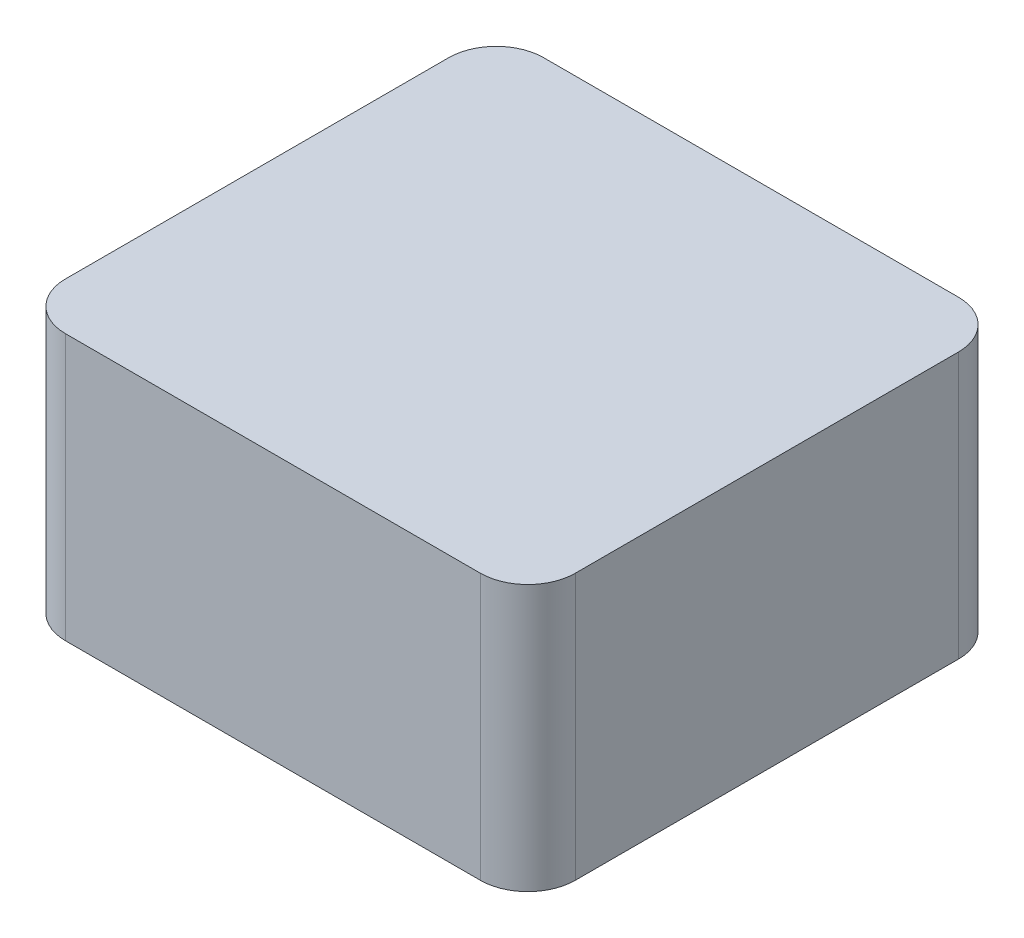
ISO-10303-21;
HEADER;
FILE_DESCRIPTION(('STEP AP214'),'2;1');
FILE_NAME('part.step','',(''),(''),'','','');
FILE_SCHEMA(('AUTOMOTIVE_DESIGN { 1 0 10303 214 1 1 1 1 }'));
ENDSEC;
DATA;
#1=APPLICATION_CONTEXT('core data for automotive mechanical design processes');
#2=APPLICATION_PROTOCOL_DEFINITION('international standard','automotive_design',2000,#1);
#3=PRODUCT_CONTEXT('',#1,'mechanical');
#4=PRODUCT('Part','Part','',(#3));
#5=PRODUCT_RELATED_PRODUCT_CATEGORY('part','',(#4));
#6=PRODUCT_DEFINITION_FORMATION('','',#4);
#7=PRODUCT_DEFINITION_CONTEXT('part definition',#1,'design');
#8=PRODUCT_DEFINITION('design','',#6,#7);
#9=PRODUCT_DEFINITION_SHAPE('','',#8);
#10=(LENGTH_UNIT() NAMED_UNIT(*) SI_UNIT(.MILLI.,.METRE.));
#11=(NAMED_UNIT(*) PLANE_ANGLE_UNIT() SI_UNIT($,.RADIAN.));
#12=(NAMED_UNIT(*) SI_UNIT($,.STERADIAN.) SOLID_ANGLE_UNIT());
#13=UNCERTAINTY_MEASURE_WITH_UNIT(LENGTH_MEASURE(1.E-05),#10,'distance_accuracy_value','');
#14=(GEOMETRIC_REPRESENTATION_CONTEXT(3) GLOBAL_UNCERTAINTY_ASSIGNED_CONTEXT((#13)) GLOBAL_UNIT_ASSIGNED_CONTEXT((#10,
#11,#12)) REPRESENTATION_CONTEXT('',''));
#15=CARTESIAN_POINT('',(0.,0.,0.));
#16=DIRECTION('',(0.,0.,1.));
#17=DIRECTION('',(1.,0.,0.));
#18=AXIS2_PLACEMENT_3D('',#15,#16,#17);
#19=CARTESIAN_POINT('',(0.,21.336,0.));
#20=DIRECTION('',(1.,0.,0.));
#21=DIRECTION('',(0.,0.,-1.));
#22=AXIS2_PLACEMENT_3D('',#19,#20,#21);
#23=PLANE('',#22);
#24=DIRECTION('',(0.,0.,1.));
#25=VECTOR('',#24,1.);
#26=CARTESIAN_POINT('',(0.,21.336,0.));
#27=LINE('',#26,#25);
#28=CARTESIAN_POINT('',(0.,21.336,3.81));
#29=VERTEX_POINT('',#28);
#30=CARTESIAN_POINT('',(0.,21.336,34.544));
#31=VERTEX_POINT('',#30);
#32=EDGE_CURVE('E118',#29,#31,#27,.T.);
#33=ORIENTED_EDGE('',*,*,#32,.F.);
#34=DIRECTION('',(0.,-1.,0.));
#35=VECTOR('',#34,1.);
#36=CARTESIAN_POINT('',(0.,21.336,3.81));
#37=LINE('',#36,#35);
#38=CARTESIAN_POINT('',(0.,0.,3.81));
#39=VERTEX_POINT('',#38);
#40=EDGE_CURVE('E103',#29,#39,#37,.T.);
#41=ORIENTED_EDGE('',*,*,#40,.T.);
#42=DIRECTION('',(0.,0.,1.));
#43=VECTOR('',#42,1.);
#44=CARTESIAN_POINT('',(0.,0.,0.));
#45=LINE('',#44,#43);
#46=CARTESIAN_POINT('',(0.,0.,34.544));
#47=VERTEX_POINT('',#46);
#48=EDGE_CURVE('E115',#39,#47,#45,.T.);
#49=ORIENTED_EDGE('',*,*,#48,.T.);
#50=DIRECTION('',(0.,-1.,0.));
#51=VECTOR('',#50,1.);
#52=CARTESIAN_POINT('',(0.,21.336,34.544));
#53=LINE('',#52,#51);
#54=EDGE_CURVE('E120',#47,#31,#53,.F.);
#55=ORIENTED_EDGE('',*,*,#54,.T.);
#56=EDGE_LOOP('',(#33,#41,#49,#55));
#57=FACE_BOUND('',#56,.T.);
#58=ADVANCED_FACE('F33',(#57),#23,.F.);
#59=CARTESIAN_POINT('',(0.,21.336,38.354));
#60=DIRECTION('',(0.,0.,-1.));
#61=DIRECTION('',(-1.,0.,0.));
#62=AXIS2_PLACEMENT_3D('',#59,#60,#61);
#63=PLANE('',#62);
#64=DIRECTION('',(1.,0.,0.));
#65=VECTOR('',#64,1.);
#66=CARTESIAN_POINT('',(0.,0.,38.354));
#67=LINE('',#66,#65);
#68=CARTESIAN_POINT('',(3.81000000000001,0.,38.354));
#69=VERTEX_POINT('',#68);
#70=CARTESIAN_POINT('',(37.084,0.,38.354));
#71=VERTEX_POINT('',#70);
#72=EDGE_CURVE('E124',#69,#71,#67,.T.);
#73=ORIENTED_EDGE('',*,*,#72,.T.);
#74=DIRECTION('',(0.,-1.,0.));
#75=VECTOR('',#74,1.);
#76=CARTESIAN_POINT('',(37.084,21.336,38.354));
#77=LINE('',#76,#75);
#78=CARTESIAN_POINT('',(37.084,21.336,38.354));
#79=VERTEX_POINT('',#78);
#80=EDGE_CURVE('E11',#71,#79,#77,.F.);
#81=ORIENTED_EDGE('',*,*,#80,.T.);
#82=DIRECTION('',(1.,0.,0.));
#83=VECTOR('',#82,1.);
#84=CARTESIAN_POINT('',(0.,21.336,38.354));
#85=LINE('',#84,#83);
#86=CARTESIAN_POINT('',(3.81000000000001,21.336,38.354));
#87=VERTEX_POINT('',#86);
#88=EDGE_CURVE('E160',#87,#79,#85,.T.);
#89=ORIENTED_EDGE('',*,*,#88,.F.);
#90=DIRECTION('',(0.,-1.,0.));
#91=VECTOR('',#90,1.);
#92=CARTESIAN_POINT('',(3.81000000000001,21.336,38.354));
#93=LINE('',#92,#91);
#94=EDGE_CURVE('E41',#87,#69,#93,.T.);
#95=ORIENTED_EDGE('',*,*,#94,.T.);
#96=EDGE_LOOP('',(#73,#81,#89,#95));
#97=FACE_BOUND('',#96,.T.);
#98=ADVANCED_FACE('F158',(#97),#63,.F.);
#99=CARTESIAN_POINT('',(40.894,21.336,0.));
#100=DIRECTION('',(-1.,0.,0.));
#101=DIRECTION('',(0.,0.,1.));
#102=AXIS2_PLACEMENT_3D('',#99,#100,#101);
#103=PLANE('',#102);
#104=DIRECTION('',(0.,0.,-1.));
#105=VECTOR('',#104,1.);
#106=CARTESIAN_POINT('',(40.894,0.,0.));
#107=LINE('',#106,#105);
#108=CARTESIAN_POINT('',(40.894,0.,34.544));
#109=VERTEX_POINT('',#108);
#110=CARTESIAN_POINT('',(40.894,0.,3.81));
#111=VERTEX_POINT('',#110);
#112=EDGE_CURVE('E127',#109,#111,#107,.T.);
#113=ORIENTED_EDGE('',*,*,#112,.T.);
#114=DIRECTION('',(0.,-1.,0.));
#115=VECTOR('',#114,1.);
#116=CARTESIAN_POINT('',(40.894,21.336,3.81));
#117=LINE('',#116,#115);
#118=CARTESIAN_POINT('',(40.894,21.336,3.81));
#119=VERTEX_POINT('',#118);
#120=EDGE_CURVE('E48',#111,#119,#117,.F.);
#121=ORIENTED_EDGE('',*,*,#120,.T.);
#122=DIRECTION('',(0.,0.,-1.));
#123=VECTOR('',#122,1.);
#124=CARTESIAN_POINT('',(40.894,21.336,0.));
#125=LINE('',#124,#123);
#126=CARTESIAN_POINT('',(40.894,21.336,34.544));
#127=VERTEX_POINT('',#126);
#128=EDGE_CURVE('E168',#127,#119,#125,.T.);
#129=ORIENTED_EDGE('',*,*,#128,.F.);
#130=DIRECTION('',(0.,-1.,0.));
#131=VECTOR('',#130,1.);
#132=CARTESIAN_POINT('',(40.894,21.336,34.544));
#133=LINE('',#132,#131);
#134=EDGE_CURVE('E151',#127,#109,#133,.T.);
#135=ORIENTED_EDGE('',*,*,#134,.T.);
#136=EDGE_LOOP('',(#113,#121,#129,#135));
#137=FACE_BOUND('',#136,.T.);
#138=ADVANCED_FACE('F167',(#137),#103,.F.);
#139=CARTESIAN_POINT('',(0.,21.336,0.));
#140=DIRECTION('',(0.,0.,1.));
#141=DIRECTION('',(1.,0.,0.));
#142=AXIS2_PLACEMENT_3D('',#139,#140,#141);
#143=PLANE('',#142);
#144=DIRECTION('',(-1.,0.,0.));
#145=VECTOR('',#144,1.);
#146=CARTESIAN_POINT('',(0.,0.,0.));
#147=LINE('',#146,#145);
#148=CARTESIAN_POINT('',(37.084,0.,0.));
#149=VERTEX_POINT('',#148);
#150=CARTESIAN_POINT('',(3.81,0.,0.));
#151=VERTEX_POINT('',#150);
#152=EDGE_CURVE('E134',#149,#151,#147,.T.);
#153=ORIENTED_EDGE('',*,*,#152,.T.);
#154=DIRECTION('',(0.,-1.,0.));
#155=VECTOR('',#154,1.);
#156=CARTESIAN_POINT('',(3.81,21.336,0.));
#157=LINE('',#156,#155);
#158=CARTESIAN_POINT('',(3.81,21.336,0.));
#159=VERTEX_POINT('',#158);
#160=EDGE_CURVE('E104',#151,#159,#157,.F.);
#161=ORIENTED_EDGE('',*,*,#160,.T.);
#162=DIRECTION('',(-1.,0.,0.));
#163=VECTOR('',#162,1.);
#164=CARTESIAN_POINT('',(0.,21.336,0.));
#165=LINE('',#164,#163);
#166=CARTESIAN_POINT('',(37.084,21.336,0.));
#167=VERTEX_POINT('',#166);
#168=EDGE_CURVE('E130',#167,#159,#165,.T.);
#169=ORIENTED_EDGE('',*,*,#168,.F.);
#170=DIRECTION('',(0.,-1.,0.));
#171=VECTOR('',#170,1.);
#172=CARTESIAN_POINT('',(37.084,21.336,0.));
#173=LINE('',#172,#171);
#174=EDGE_CURVE('E109',#167,#149,#173,.T.);
#175=ORIENTED_EDGE('',*,*,#174,.T.);
#176=EDGE_LOOP('',(#153,#161,#169,#175));
#177=FACE_BOUND('',#176,.T.);
#178=ADVANCED_FACE('F196',(#177),#143,.F.);
#179=CARTESIAN_POINT('',(0.,21.336,0.));
#180=DIRECTION('',(0.,1.,0.));
#181=DIRECTION('',(0.,0.,1.));
#182=AXIS2_PLACEMENT_3D('',#179,#180,#181);
#183=PLANE('',#182);
#184=ORIENTED_EDGE('',*,*,#168,.T.);
#185=CARTESIAN_POINT('',(3.81,21.336,3.81));
#186=DIRECTION('',(0.,1.,0.));
#187=DIRECTION('',(0.,0.,1.));
#188=AXIS2_PLACEMENT_3D('',#185,#186,#187);
#189=CIRCLE('',#188,3.81);
#190=EDGE_CURVE('E149',#159,#29,#189,.T.);
#191=ORIENTED_EDGE('',*,*,#190,.T.);
#192=ORIENTED_EDGE('',*,*,#32,.T.);
#193=CARTESIAN_POINT('',(3.81000000000001,21.336,34.544));
#194=DIRECTION('',(0.,1.,0.));
#195=DIRECTION('',(0.,0.,1.));
#196=AXIS2_PLACEMENT_3D('',#193,#194,#195);
#197=CIRCLE('',#196,3.81);
#198=EDGE_CURVE('E144',#31,#87,#197,.T.);
#199=ORIENTED_EDGE('',*,*,#198,.T.);
#200=ORIENTED_EDGE('',*,*,#88,.T.);
#201=CARTESIAN_POINT('',(37.084,21.336,34.544));
#202=DIRECTION('',(0.,1.,0.));
#203=DIRECTION('',(0.,0.,1.));
#204=AXIS2_PLACEMENT_3D('',#201,#202,#203);
#205=CIRCLE('',#204,3.81);
#206=EDGE_CURVE('E55',#79,#127,#205,.T.);
#207=ORIENTED_EDGE('',*,*,#206,.T.);
#208=ORIENTED_EDGE('',*,*,#128,.T.);
#209=CARTESIAN_POINT('',(37.084,21.336,3.81));
#210=DIRECTION('',(0.,1.,0.));
#211=DIRECTION('',(0.,0.,1.));
#212=AXIS2_PLACEMENT_3D('',#209,#210,#211);
#213=CIRCLE('',#212,3.81);
#214=EDGE_CURVE('E147',#119,#167,#213,.T.);
#215=ORIENTED_EDGE('',*,*,#214,.T.);
#216=EDGE_LOOP('',(#184,#191,#192,#199,#200,#207,#208,#215));
#217=FACE_BOUND('',#216,.T.);
#218=ADVANCED_FACE('F173',(#217),#183,.T.);
#219=CARTESIAN_POINT('',(0.,0.,0.));
#220=DIRECTION('',(0.,1.,0.));
#221=DIRECTION('',(0.,0.,1.));
#222=AXIS2_PLACEMENT_3D('',#219,#220,#221);
#223=PLANE('',#222);
#224=ORIENTED_EDGE('',*,*,#48,.F.);
#225=CARTESIAN_POINT('',(3.81,0.,3.81));
#226=DIRECTION('',(0.,1.,0.));
#227=DIRECTION('',(0.,0.,1.));
#228=AXIS2_PLACEMENT_3D('',#225,#226,#227);
#229=CIRCLE('',#228,3.81);
#230=EDGE_CURVE('E99',#39,#151,#229,.F.);
#231=ORIENTED_EDGE('',*,*,#230,.T.);
#232=ORIENTED_EDGE('',*,*,#152,.F.);
#233=CARTESIAN_POINT('',(37.084,0.,3.81));
#234=DIRECTION('',(0.,1.,0.));
#235=DIRECTION('',(0.,0.,1.));
#236=AXIS2_PLACEMENT_3D('',#233,#234,#235);
#237=CIRCLE('',#236,3.81);
#238=EDGE_CURVE('E110',#149,#111,#237,.F.);
#239=ORIENTED_EDGE('',*,*,#238,.T.);
#240=ORIENTED_EDGE('',*,*,#112,.F.);
#241=CARTESIAN_POINT('',(37.084,0.,34.544));
#242=DIRECTION('',(0.,1.,0.));
#243=DIRECTION('',(0.,0.,1.));
#244=AXIS2_PLACEMENT_3D('',#241,#242,#243);
#245=CIRCLE('',#244,3.81);
#246=EDGE_CURVE('E138',#109,#71,#245,.F.);
#247=ORIENTED_EDGE('',*,*,#246,.T.);
#248=ORIENTED_EDGE('',*,*,#72,.F.);
#249=CARTESIAN_POINT('',(3.81000000000001,0.,34.544));
#250=DIRECTION('',(0.,1.,0.));
#251=DIRECTION('',(0.,0.,1.));
#252=AXIS2_PLACEMENT_3D('',#249,#250,#251);
#253=CIRCLE('',#252,3.81);
#254=EDGE_CURVE('E119',#69,#47,#253,.F.);
#255=ORIENTED_EDGE('',*,*,#254,.T.);
#256=EDGE_LOOP('',(#224,#231,#232,#239,#240,#247,#248,#255));
#257=FACE_BOUND('',#256,.T.);
#258=ADVANCED_FACE('F122',(#257),#223,.F.);
#259=CARTESIAN_POINT('',(3.81,21.336,3.81));
#260=DIRECTION('',(0.,-1.,0.));
#261=DIRECTION('',(0.,0.,-1.));
#262=AXIS2_PLACEMENT_3D('',#259,#260,#261);
#263=CYLINDRICAL_SURFACE('',#262,3.81);
#264=ORIENTED_EDGE('',*,*,#190,.F.);
#265=ORIENTED_EDGE('',*,*,#160,.F.);
#266=ORIENTED_EDGE('',*,*,#230,.F.);
#267=ORIENTED_EDGE('',*,*,#40,.F.);
#268=EDGE_LOOP('',(#264,#265,#266,#267));
#269=FACE_BOUND('',#268,.T.);
#270=ADVANCED_FACE('F102',(#269),#263,.T.);
#271=CARTESIAN_POINT('',(37.084,21.336,3.81));
#272=DIRECTION('',(0.,-1.,0.));
#273=DIRECTION('',(0.,0.,-1.));
#274=AXIS2_PLACEMENT_3D('',#271,#272,#273);
#275=CYLINDRICAL_SURFACE('',#274,3.81);
#276=ORIENTED_EDGE('',*,*,#214,.F.);
#277=ORIENTED_EDGE('',*,*,#120,.F.);
#278=ORIENTED_EDGE('',*,*,#238,.F.);
#279=ORIENTED_EDGE('',*,*,#174,.F.);
#280=EDGE_LOOP('',(#276,#277,#278,#279));
#281=FACE_BOUND('',#280,.T.);
#282=ADVANCED_FACE('F178',(#281),#275,.T.);
#283=CARTESIAN_POINT('',(37.084,21.336,34.544));
#284=DIRECTION('',(0.,-1.,0.));
#285=DIRECTION('',(0.,0.,-1.));
#286=AXIS2_PLACEMENT_3D('',#283,#284,#285);
#287=CYLINDRICAL_SURFACE('',#286,3.81);
#288=ORIENTED_EDGE('',*,*,#206,.F.);
#289=ORIENTED_EDGE('',*,*,#80,.F.);
#290=ORIENTED_EDGE('',*,*,#246,.F.);
#291=ORIENTED_EDGE('',*,*,#134,.F.);
#292=EDGE_LOOP('',(#288,#289,#290,#291));
#293=FACE_BOUND('',#292,.T.);
#294=ADVANCED_FACE('F166',(#293),#287,.T.);
#295=CARTESIAN_POINT('',(3.81000000000001,21.336,34.544));
#296=DIRECTION('',(0.,-1.,0.));
#297=DIRECTION('',(0.,0.,-1.));
#298=AXIS2_PLACEMENT_3D('',#295,#296,#297);
#299=CYLINDRICAL_SURFACE('',#298,3.81);
#300=ORIENTED_EDGE('',*,*,#198,.F.);
#301=ORIENTED_EDGE('',*,*,#54,.F.);
#302=ORIENTED_EDGE('',*,*,#254,.F.);
#303=ORIENTED_EDGE('',*,*,#94,.F.);
#304=EDGE_LOOP('',(#300,#301,#302,#303));
#305=FACE_BOUND('',#304,.T.);
#306=ADVANCED_FACE('F35',(#305),#299,.T.);
#307=CLOSED_SHELL('',(#58,#98,#138,#178,#218,#258,#270,#282,#294,#306));
#308=MANIFOLD_SOLID_BREP('B2',#307);
#309=ADVANCED_BREP_SHAPE_REPRESENTATION('',(#18,#308),#14);
#310=SHAPE_DEFINITION_REPRESENTATION(#9,#309);
ENDSEC;
END-ISO-10303-21;
